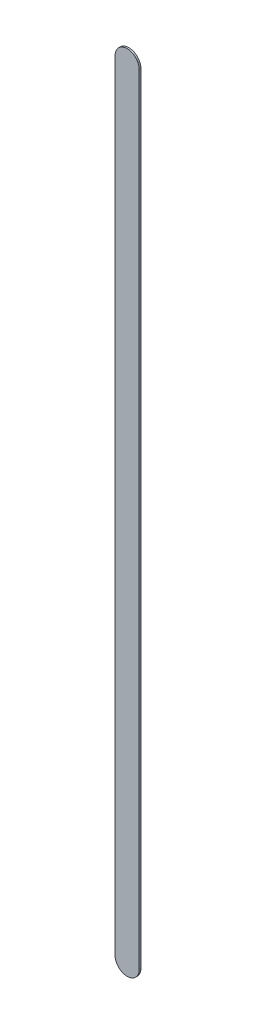
ISO-10303-21;
HEADER;
FILE_DESCRIPTION(('STEP AP214'),'2;1');
FILE_NAME('part.step','',(''),(''),'','','');
FILE_SCHEMA(('AUTOMOTIVE_DESIGN { 1 0 10303 214 1 1 1 1 }'));
ENDSEC;
DATA;
#1=APPLICATION_CONTEXT('core data for automotive mechanical design processes');
#2=APPLICATION_PROTOCOL_DEFINITION('international standard','automotive_design',2000,#1);
#3=PRODUCT_CONTEXT('',#1,'mechanical');
#4=PRODUCT('Part','Part','',(#3));
#5=PRODUCT_RELATED_PRODUCT_CATEGORY('part','',(#4));
#6=PRODUCT_DEFINITION_FORMATION('','',#4);
#7=PRODUCT_DEFINITION_CONTEXT('part definition',#1,'design');
#8=PRODUCT_DEFINITION('design','',#6,#7);
#9=PRODUCT_DEFINITION_SHAPE('','',#8);
#10=(LENGTH_UNIT() NAMED_UNIT(*) SI_UNIT(.MILLI.,.METRE.));
#11=(NAMED_UNIT(*) PLANE_ANGLE_UNIT() SI_UNIT($,.RADIAN.));
#12=(NAMED_UNIT(*) SI_UNIT($,.STERADIAN.) SOLID_ANGLE_UNIT());
#13=UNCERTAINTY_MEASURE_WITH_UNIT(LENGTH_MEASURE(1.E-05),#10,'distance_accuracy_value','');
#14=(GEOMETRIC_REPRESENTATION_CONTEXT(3) GLOBAL_UNCERTAINTY_ASSIGNED_CONTEXT((#13)) GLOBAL_UNIT_ASSIGNED_CONTEXT((#10,
#11,#12)) REPRESENTATION_CONTEXT('',''));
#15=CARTESIAN_POINT('',(0.,0.,0.));
#16=DIRECTION('',(0.,0.,1.));
#17=DIRECTION('',(1.,0.,0.));
#18=AXIS2_PLACEMENT_3D('',#15,#16,#17);
#19=CARTESIAN_POINT('',(108.1499996,88.5000008,0.));
#20=DIRECTION('',(-1.,0.,0.));
#21=DIRECTION('',(0.,1.,0.));
#22=AXIS2_PLACEMENT_3D('',#19,#20,#21);
#23=PLANE('',#22);
#24=DIRECTION('',(0.,1.,0.));
#25=VECTOR('',#24,1.);
#26=CARTESIAN_POINT('',(108.1499996,88.5000008,0.03556));
#27=LINE('',#26,#25);
#28=CARTESIAN_POINT('',(108.1499996,88.5000008,0.03556));
#29=VERTEX_POINT('',#28);
#30=CARTESIAN_POINT('',(108.1499996,104.62201072,0.03556));
#31=VERTEX_POINT('',#30);
#32=EDGE_CURVE('E11',#29,#31,#27,.T.);
#33=ORIENTED_EDGE('',*,*,#32,.F.);
#34=DIRECTION('',(0.,0.,1.));
#35=VECTOR('',#34,1.);
#36=CARTESIAN_POINT('',(108.1499996,88.5000008,0.));
#37=LINE('',#36,#35);
#38=CARTESIAN_POINT('',(108.1499996,88.5000008,0.));
#39=VERTEX_POINT('',#38);
#40=EDGE_CURVE('E24',#39,#29,#37,.T.);
#41=ORIENTED_EDGE('',*,*,#40,.F.);
#42=DIRECTION('',(0.,1.,0.));
#43=VECTOR('',#42,1.);
#44=CARTESIAN_POINT('',(108.1499996,88.5000008,0.));
#45=LINE('',#44,#43);
#46=CARTESIAN_POINT('',(108.1499996,104.62201072,0.));
#47=VERTEX_POINT('',#46);
#48=EDGE_CURVE('E75',#39,#47,#45,.T.);
#49=ORIENTED_EDGE('',*,*,#48,.T.);
#50=DIRECTION('',(0.,0.,1.));
#51=VECTOR('',#50,1.);
#52=CARTESIAN_POINT('',(108.1499996,104.62201072,0.));
#53=LINE('',#52,#51);
#54=EDGE_CURVE('E37',#47,#31,#53,.T.);
#55=ORIENTED_EDGE('',*,*,#54,.T.);
#56=EDGE_LOOP('',(#33,#41,#49,#55));
#57=FACE_BOUND('',#56,.T.);
#58=ADVANCED_FACE('F17',(#57),#23,.F.);
#59=CARTESIAN_POINT('',(107.9000001,104.62201072,0.));
#60=DIRECTION('',(0.,0.,-1.));
#61=DIRECTION('',(1.,0.,0.));
#62=AXIS2_PLACEMENT_3D('',#59,#60,#61);
#63=CYLINDRICAL_SURFACE('',#62,0.249999500000001);
#64=CARTESIAN_POINT('',(107.9000001,104.62201072,0.03556));
#65=DIRECTION('',(0.,0.,1.));
#66=DIRECTION('',(1.,0.,0.));
#67=AXIS2_PLACEMENT_3D('',#64,#65,#66);
#68=CIRCLE('',#67,0.249999500000001);
#69=CARTESIAN_POINT('',(107.6500006,104.62201072,0.03556));
#70=VERTEX_POINT('',#69);
#71=EDGE_CURVE('E83',#31,#70,#68,.T.);
#72=ORIENTED_EDGE('',*,*,#71,.F.);
#73=ORIENTED_EDGE('',*,*,#54,.F.);
#74=CARTESIAN_POINT('',(107.9000001,104.62201072,0.));
#75=DIRECTION('',(0.,0.,1.));
#76=DIRECTION('',(1.,0.,0.));
#77=AXIS2_PLACEMENT_3D('',#74,#75,#76);
#78=CIRCLE('',#77,0.249999500000001);
#79=CARTESIAN_POINT('',(107.6500006,104.62201072,0.));
#80=VERTEX_POINT('',#79);
#81=EDGE_CURVE('E81',#47,#80,#78,.T.);
#82=ORIENTED_EDGE('',*,*,#81,.T.);
#83=DIRECTION('',(0.,0.,1.));
#84=VECTOR('',#83,1.);
#85=CARTESIAN_POINT('',(107.6500006,104.62201072,0.));
#86=LINE('',#85,#84);
#87=EDGE_CURVE('E67',#80,#70,#86,.T.);
#88=ORIENTED_EDGE('',*,*,#87,.T.);
#89=EDGE_LOOP('',(#72,#73,#82,#88));
#90=FACE_BOUND('',#89,.T.);
#91=ADVANCED_FACE('F89',(#90),#63,.T.);
#92=CARTESIAN_POINT('',(107.6500006,104.62201072,0.));
#93=DIRECTION('',(1.,0.,0.));
#94=DIRECTION('',(0.,-1.,0.));
#95=AXIS2_PLACEMENT_3D('',#92,#93,#94);
#96=PLANE('',#95);
#97=DIRECTION('',(0.,-1.,0.));
#98=VECTOR('',#97,1.);
#99=CARTESIAN_POINT('',(107.6500006,104.62201072,0.03556));
#100=LINE('',#99,#98);
#101=CARTESIAN_POINT('',(107.6500006,88.5000008,0.03556));
#102=VERTEX_POINT('',#101);
#103=EDGE_CURVE('E71',#70,#102,#100,.T.);
#104=ORIENTED_EDGE('',*,*,#103,.F.);
#105=ORIENTED_EDGE('',*,*,#87,.F.);
#106=DIRECTION('',(0.,-1.,0.));
#107=VECTOR('',#106,1.);
#108=CARTESIAN_POINT('',(107.6500006,104.62201072,0.));
#109=LINE('',#108,#107);
#110=CARTESIAN_POINT('',(107.6500006,88.5000008,0.));
#111=VERTEX_POINT('',#110);
#112=EDGE_CURVE('E63',#80,#111,#109,.T.);
#113=ORIENTED_EDGE('',*,*,#112,.T.);
#114=DIRECTION('',(0.,0.,1.));
#115=VECTOR('',#114,1.);
#116=CARTESIAN_POINT('',(107.6500006,88.5000008,0.));
#117=LINE('',#116,#115);
#118=EDGE_CURVE('E53',#111,#102,#117,.T.);
#119=ORIENTED_EDGE('',*,*,#118,.T.);
#120=EDGE_LOOP('',(#104,#105,#113,#119));
#121=FACE_BOUND('',#120,.T.);
#122=ADVANCED_FACE('F66',(#121),#96,.F.);
#123=CARTESIAN_POINT('',(107.9000001,88.5000008,0.));
#124=DIRECTION('',(0.,0.,-1.));
#125=DIRECTION('',(-1.,0.,0.));
#126=AXIS2_PLACEMENT_3D('',#123,#124,#125);
#127=CYLINDRICAL_SURFACE('',#126,0.249999500000001);
#128=CARTESIAN_POINT('',(107.9000001,88.5000008,0.03556));
#129=DIRECTION('',(0.,0.,1.));
#130=DIRECTION('',(-1.,0.,0.));
#131=AXIS2_PLACEMENT_3D('',#128,#129,#130);
#132=CIRCLE('',#131,0.249999500000001);
#133=EDGE_CURVE('E59',#102,#29,#132,.T.);
#134=ORIENTED_EDGE('',*,*,#133,.F.);
#135=ORIENTED_EDGE('',*,*,#118,.F.);
#136=CARTESIAN_POINT('',(107.9000001,88.5000008,0.));
#137=DIRECTION('',(0.,0.,1.));
#138=DIRECTION('',(-1.,0.,0.));
#139=AXIS2_PLACEMENT_3D('',#136,#137,#138);
#140=CIRCLE('',#139,0.249999500000001);
#141=EDGE_CURVE('E57',#111,#39,#140,.T.);
#142=ORIENTED_EDGE('',*,*,#141,.T.);
#143=ORIENTED_EDGE('',*,*,#40,.T.);
#144=EDGE_LOOP('',(#134,#135,#142,#143));
#145=FACE_BOUND('',#144,.T.);
#146=ADVANCED_FACE('F55',(#145),#127,.T.);
#147=CARTESIAN_POINT('',(108.1499996,88.5000008,0.));
#148=DIRECTION('',(0.,0.,-1.));
#149=DIRECTION('',(-1.,0.,0.));
#150=AXIS2_PLACEMENT_3D('',#147,#148,#149);
#151=PLANE('',#150);
#152=ORIENTED_EDGE('',*,*,#141,.F.);
#153=ORIENTED_EDGE('',*,*,#112,.F.);
#154=ORIENTED_EDGE('',*,*,#81,.F.);
#155=ORIENTED_EDGE('',*,*,#48,.F.);
#156=EDGE_LOOP('',(#152,#153,#154,#155));
#157=FACE_BOUND('',#156,.T.);
#158=ADVANCED_FACE('F74',(#157),#151,.T.);
#159=CARTESIAN_POINT('',(108.1499996,88.5000008,0.03556));
#160=DIRECTION('',(0.,0.,-1.));
#161=DIRECTION('',(-1.,0.,0.));
#162=AXIS2_PLACEMENT_3D('',#159,#160,#161);
#163=PLANE('',#162);
#164=ORIENTED_EDGE('',*,*,#32,.T.);
#165=ORIENTED_EDGE('',*,*,#71,.T.);
#166=ORIENTED_EDGE('',*,*,#103,.T.);
#167=ORIENTED_EDGE('',*,*,#133,.T.);
#168=EDGE_LOOP('',(#164,#165,#166,#167));
#169=FACE_BOUND('',#168,.T.);
#170=ADVANCED_FACE('F91',(#169),#163,.F.);
#171=CLOSED_SHELL('',(#58,#91,#122,#146,#158,#170));
#172=MANIFOLD_SOLID_BREP('B1',#171);
#173=ADVANCED_BREP_SHAPE_REPRESENTATION('',(#18,#172),#14);
#174=SHAPE_DEFINITION_REPRESENTATION(#9,#173);
ENDSEC;
END-ISO-10303-21;
